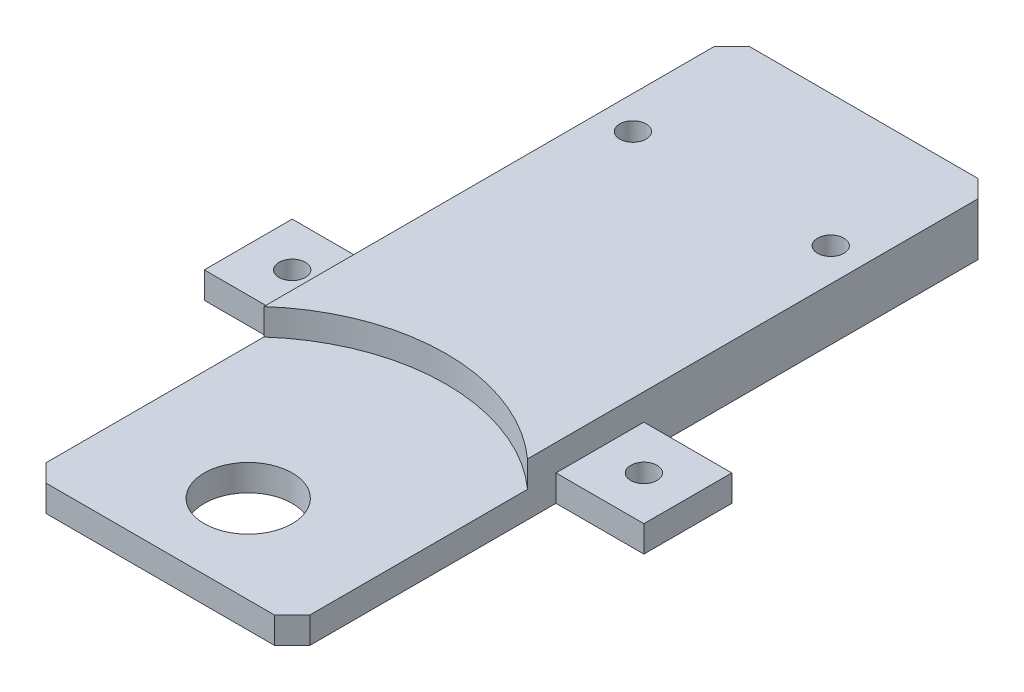
ISO-10303-21;
HEADER;
FILE_DESCRIPTION(('STEP AP214'),'2;1');
FILE_NAME('part.step','',(''),(''),'','','');
FILE_SCHEMA(('AUTOMOTIVE_DESIGN { 1 0 10303 214 1 1 1 1 }'));
ENDSEC;
DATA;
#1=APPLICATION_CONTEXT('core data for automotive mechanical design processes');
#2=APPLICATION_PROTOCOL_DEFINITION('international standard','automotive_design',2000,#1);
#3=PRODUCT_CONTEXT('',#1,'mechanical');
#4=PRODUCT('Part','Part','',(#3));
#5=PRODUCT_RELATED_PRODUCT_CATEGORY('part','',(#4));
#6=PRODUCT_DEFINITION_FORMATION('','',#4);
#7=PRODUCT_DEFINITION_CONTEXT('part definition',#1,'design');
#8=PRODUCT_DEFINITION('design','',#6,#7);
#9=PRODUCT_DEFINITION_SHAPE('','',#8);
#10=(LENGTH_UNIT() NAMED_UNIT(*) SI_UNIT(.MILLI.,.METRE.));
#11=(NAMED_UNIT(*) PLANE_ANGLE_UNIT() SI_UNIT($,.RADIAN.));
#12=(NAMED_UNIT(*) SI_UNIT($,.STERADIAN.) SOLID_ANGLE_UNIT());
#13=UNCERTAINTY_MEASURE_WITH_UNIT(LENGTH_MEASURE(1.E-05),#10,'distance_accuracy_value','');
#14=(GEOMETRIC_REPRESENTATION_CONTEXT(3) GLOBAL_UNCERTAINTY_ASSIGNED_CONTEXT((#13)) GLOBAL_UNIT_ASSIGNED_CONTEXT((#10,
#11,#12)) REPRESENTATION_CONTEXT('',''));
#15=CARTESIAN_POINT('',(0.,0.,0.));
#16=DIRECTION('',(0.,0.,1.));
#17=DIRECTION('',(1.,0.,0.));
#18=AXIS2_PLACEMENT_3D('',#15,#16,#17);
#19=CARTESIAN_POINT('',(0.,3.,-80.));
#20=DIRECTION('',(1.,0.,0.));
#21=DIRECTION('',(0.,0.,-1.));
#22=AXIS2_PLACEMENT_3D('',#19,#20,#21);
#23=PLANE('',#22);
#24=DIRECTION('',(0.,1.,0.));
#25=VECTOR('',#24,1.);
#26=CARTESIAN_POINT('',(0.,3.,-30.));
#27=LINE('',#26,#25);
#28=CARTESIAN_POINT('',(0.,0.,-30.));
#29=VERTEX_POINT('',#28);
#30=CARTESIAN_POINT('',(0.,3.,-30.));
#31=VERTEX_POINT('',#30);
#32=EDGE_CURVE('E232',#29,#31,#27,.T.);
#33=ORIENTED_EDGE('',*,*,#32,.F.);
#34=DIRECTION('',(0.,0.,1.));
#35=VECTOR('',#34,1.);
#36=CARTESIAN_POINT('',(0.,0.,-80.));
#37=LINE('',#36,#35);
#38=CARTESIAN_POINT('',(0.,0.,-1.99999999999999));
#39=VERTEX_POINT('',#38);
#40=EDGE_CURVE('E325',#29,#39,#37,.T.);
#41=ORIENTED_EDGE('',*,*,#40,.T.);
#42=DIRECTION('',(0.,1.,0.));
#43=VECTOR('',#42,1.);
#44=CARTESIAN_POINT('',(0.,3.,-1.99999999999999));
#45=LINE('',#44,#43);
#46=CARTESIAN_POINT('',(0.,3.,-1.99999999999999));
#47=VERTEX_POINT('',#46);
#48=EDGE_CURVE('E382',#39,#47,#45,.T.);
#49=ORIENTED_EDGE('',*,*,#48,.T.);
#50=DIRECTION('',(0.,0.,1.));
#51=VECTOR('',#50,1.);
#52=CARTESIAN_POINT('',(0.,3.,-80.));
#53=LINE('',#52,#51);
#54=CARTESIAN_POINT('',(0.,3.,-26.7705098312484));
#55=VERTEX_POINT('',#54);
#56=EDGE_CURVE('E323',#55,#47,#53,.T.);
#57=ORIENTED_EDGE('',*,*,#56,.F.);
#58=DIRECTION('',(0.,-1.,0.));
#59=VECTOR('',#58,1.);
#60=CARTESIAN_POINT('',(0.,6.,-26.7705098312484));
#61=LINE('',#60,#59);
#62=CARTESIAN_POINT('',(0.,6.,-26.7705098312484));
#63=VERTEX_POINT('',#62);
#64=EDGE_CURVE('E315',#63,#55,#61,.T.);
#65=ORIENTED_EDGE('',*,*,#64,.F.);
#66=DIRECTION('',(0.,0.,1.));
#67=VECTOR('',#66,1.);
#68=CARTESIAN_POINT('',(0.,6.,0.));
#69=LINE('',#68,#67);
#70=CARTESIAN_POINT('',(0.,6.,-78.));
#71=VERTEX_POINT('',#70);
#72=EDGE_CURVE('E310',#71,#63,#69,.T.);
#73=ORIENTED_EDGE('',*,*,#72,.F.);
#74=DIRECTION('',(0.,-1.,0.));
#75=VECTOR('',#74,1.);
#76=CARTESIAN_POINT('',(0.,3.,-78.));
#77=LINE('',#76,#75);
#78=CARTESIAN_POINT('',(0.,0.,-78.));
#79=VERTEX_POINT('',#78);
#80=EDGE_CURVE('E387',#71,#79,#77,.T.);
#81=ORIENTED_EDGE('',*,*,#80,.T.);
#82=CARTESIAN_POINT('',(0.,0.,-40.));
#83=VERTEX_POINT('',#82);
#84=EDGE_CURVE('E336',#79,#83,#37,.T.);
#85=ORIENTED_EDGE('',*,*,#84,.T.);
#86=DIRECTION('',(0.,-1.,0.));
#87=VECTOR('',#86,1.);
#88=CARTESIAN_POINT('',(0.,3.,-40.));
#89=LINE('',#88,#87);
#90=CARTESIAN_POINT('',(0.,3.,-40.));
#91=VERTEX_POINT('',#90);
#92=EDGE_CURVE('E238',#91,#83,#89,.T.);
#93=ORIENTED_EDGE('',*,*,#92,.F.);
#94=DIRECTION('',(0.,0.,-1.));
#95=VECTOR('',#94,1.);
#96=CARTESIAN_POINT('',(0.,3.,-30.));
#97=LINE('',#96,#95);
#98=EDGE_CURVE('E75',#31,#91,#97,.T.);
#99=ORIENTED_EDGE('',*,*,#98,.F.);
#100=EDGE_LOOP('',(#33,#41,#49,#57,#65,#73,#81,#85,#93,#99));
#101=FACE_BOUND('',#100,.T.);
#102=ADVANCED_FACE('F50',(#101),#23,.F.);
#103=CARTESIAN_POINT('',(0.,3.,0.));
#104=DIRECTION('',(0.,1.,0.));
#105=DIRECTION('',(0.,0.,1.));
#106=AXIS2_PLACEMENT_3D('',#103,#104,#105);
#107=PLANE('',#106);
#108=CARTESIAN_POINT('',(15.,3.,-10.));
#109=DIRECTION('',(0.,1.,0.));
#110=DIRECTION('',(0.,0.,1.));
#111=AXIS2_PLACEMENT_3D('',#108,#109,#110);
#112=CIRCLE('',#111,5.);
#113=CARTESIAN_POINT('',(15.,3.,-5.));
#114=VERTEX_POINT('',#113);
#115=EDGE_CURVE('E280',#114,#114,#112,.T.);
#116=ORIENTED_EDGE('',*,*,#115,.F.);
#117=EDGE_LOOP('',(#116));
#118=FACE_BOUND('',#117,.T.);
#119=ORIENTED_EDGE('',*,*,#56,.T.);
#120=DIRECTION('',(-0.707106781186549,0.,-0.707106781186546));
#121=VECTOR('',#120,1.);
#122=CARTESIAN_POINT('',(0.999999999999994,3.,-0.999999999999997));
#123=LINE('',#122,#121);
#124=CARTESIAN_POINT('',(1.99999999999999,3.,0.));
#125=VERTEX_POINT('',#124);
#126=EDGE_CURVE('E11',#47,#125,#123,.F.);
#127=ORIENTED_EDGE('',*,*,#126,.T.);
#128=DIRECTION('',(1.,0.,0.));
#129=VECTOR('',#128,1.);
#130=CARTESIAN_POINT('',(0.,3.,0.));
#131=LINE('',#130,#129);
#132=CARTESIAN_POINT('',(28.,3.,0.));
#133=VERTEX_POINT('',#132);
#134=EDGE_CURVE('E330',#125,#133,#131,.T.);
#135=ORIENTED_EDGE('',*,*,#134,.T.);
#136=DIRECTION('',(-0.707106781186548,0.,0.707106781186548));
#137=VECTOR('',#136,1.);
#138=CARTESIAN_POINT('',(14.,3.,14.));
#139=LINE('',#138,#137);
#140=CARTESIAN_POINT('',(30.,3.,-2.00000000000002));
#141=VERTEX_POINT('',#140);
#142=EDGE_CURVE('E60',#133,#141,#139,.F.);
#143=ORIENTED_EDGE('',*,*,#142,.T.);
#144=DIRECTION('',(0.,0.,-1.));
#145=VECTOR('',#144,1.);
#146=CARTESIAN_POINT('',(30.,3.,-80.));
#147=LINE('',#146,#145);
#148=CARTESIAN_POINT('',(30.,3.,-26.7705098312485));
#149=VERTEX_POINT('',#148);
#150=EDGE_CURVE('E335',#141,#149,#147,.T.);
#151=ORIENTED_EDGE('',*,*,#150,.T.);
#152=CARTESIAN_POINT('',(15.,3.,-10.));
#153=DIRECTION('',(0.,1.,0.));
#154=DIRECTION('',(0.,0.,1.));
#155=AXIS2_PLACEMENT_3D('',#152,#153,#154);
#156=CIRCLE('',#155,22.5);
#157=EDGE_CURVE('E291',#149,#55,#156,.T.);
#158=ORIENTED_EDGE('',*,*,#157,.T.);
#159=EDGE_LOOP('',(#119,#127,#135,#143,#151,#158));
#160=FACE_BOUND('',#159,.T.);
#161=ADVANCED_FACE('F399',(#118,#160),#107,.T.);
#162=CARTESIAN_POINT('',(0.,3.,0.));
#163=DIRECTION('',(0.,0.,-1.));
#164=DIRECTION('',(-1.,0.,0.));
#165=AXIS2_PLACEMENT_3D('',#162,#163,#164);
#166=PLANE('',#165);
#167=ORIENTED_EDGE('',*,*,#134,.F.);
#168=DIRECTION('',(0.,-1.,0.));
#169=VECTOR('',#168,1.);
#170=CARTESIAN_POINT('',(1.99999999999999,3.,0.));
#171=LINE('',#170,#169);
#172=CARTESIAN_POINT('',(1.99999999999999,0.,0.));
#173=VERTEX_POINT('',#172);
#174=EDGE_CURVE('E394',#125,#173,#171,.T.);
#175=ORIENTED_EDGE('',*,*,#174,.T.);
#176=DIRECTION('',(1.,0.,0.));
#177=VECTOR('',#176,1.);
#178=CARTESIAN_POINT('',(0.,0.,0.));
#179=LINE('',#178,#177);
#180=CARTESIAN_POINT('',(28.,0.,0.));
#181=VERTEX_POINT('',#180);
#182=EDGE_CURVE('E338',#173,#181,#179,.T.);
#183=ORIENTED_EDGE('',*,*,#182,.T.);
#184=DIRECTION('',(0.,1.,0.));
#185=VECTOR('',#184,1.);
#186=CARTESIAN_POINT('',(28.,3.,0.));
#187=LINE('',#186,#185);
#188=EDGE_CURVE('E388',#181,#133,#187,.T.);
#189=ORIENTED_EDGE('',*,*,#188,.T.);
#190=EDGE_LOOP('',(#167,#175,#183,#189));
#191=FACE_BOUND('',#190,.T.);
#192=ADVANCED_FACE('F413',(#191),#166,.F.);
#193=CARTESIAN_POINT('',(30.,3.,-80.));
#194=DIRECTION('',(-1.,0.,0.));
#195=DIRECTION('',(0.,0.,1.));
#196=AXIS2_PLACEMENT_3D('',#193,#194,#195);
#197=PLANE('',#196);
#198=DIRECTION('',(0.,0.,-1.));
#199=VECTOR('',#198,1.);
#200=CARTESIAN_POINT('',(30.,0.,-80.));
#201=LINE('',#200,#199);
#202=CARTESIAN_POINT('',(30.,0.,-2.00000000000002));
#203=VERTEX_POINT('',#202);
#204=CARTESIAN_POINT('',(30.,0.,-30.));
#205=VERTEX_POINT('',#204);
#206=EDGE_CURVE('E342',#203,#205,#201,.T.);
#207=ORIENTED_EDGE('',*,*,#206,.T.);
#208=DIRECTION('',(0.,1.,0.));
#209=VECTOR('',#208,1.);
#210=CARTESIAN_POINT('',(30.,3.,-30.));
#211=LINE('',#210,#209);
#212=CARTESIAN_POINT('',(30.,3.,-30.));
#213=VERTEX_POINT('',#212);
#214=EDGE_CURVE('E179',#205,#213,#211,.T.);
#215=ORIENTED_EDGE('',*,*,#214,.T.);
#216=DIRECTION('',(0.,0.,-1.));
#217=VECTOR('',#216,1.);
#218=CARTESIAN_POINT('',(30.,3.,-30.));
#219=LINE('',#218,#217);
#220=CARTESIAN_POINT('',(30.,3.,-40.));
#221=VERTEX_POINT('',#220);
#222=EDGE_CURVE('E198',#213,#221,#219,.T.);
#223=ORIENTED_EDGE('',*,*,#222,.T.);
#224=DIRECTION('',(0.,-1.,0.));
#225=VECTOR('',#224,1.);
#226=CARTESIAN_POINT('',(30.,3.,-40.));
#227=LINE('',#226,#225);
#228=CARTESIAN_POINT('',(30.,0.,-40.));
#229=VERTEX_POINT('',#228);
#230=EDGE_CURVE('E213',#221,#229,#227,.T.);
#231=ORIENTED_EDGE('',*,*,#230,.T.);
#232=CARTESIAN_POINT('',(30.,0.,-78.));
#233=VERTEX_POINT('',#232);
#234=EDGE_CURVE('E341',#229,#233,#201,.T.);
#235=ORIENTED_EDGE('',*,*,#234,.T.);
#236=DIRECTION('',(0.,1.,0.));
#237=VECTOR('',#236,1.);
#238=CARTESIAN_POINT('',(30.,3.,-78.));
#239=LINE('',#238,#237);
#240=CARTESIAN_POINT('',(30.,6.,-78.));
#241=VERTEX_POINT('',#240);
#242=EDGE_CURVE('E372',#233,#241,#239,.T.);
#243=ORIENTED_EDGE('',*,*,#242,.T.);
#244=DIRECTION('',(0.,0.,-1.));
#245=VECTOR('',#244,1.);
#246=CARTESIAN_POINT('',(30.,6.,0.));
#247=LINE('',#246,#245);
#248=CARTESIAN_POINT('',(30.,6.,-26.7705098312485));
#249=VERTEX_POINT('',#248);
#250=EDGE_CURVE('E303',#249,#241,#247,.T.);
#251=ORIENTED_EDGE('',*,*,#250,.F.);
#252=DIRECTION('',(0.,-1.,0.));
#253=VECTOR('',#252,1.);
#254=CARTESIAN_POINT('',(30.,6.,-26.7705098312485));
#255=LINE('',#254,#253);
#256=EDGE_CURVE('E318',#249,#149,#255,.T.);
#257=ORIENTED_EDGE('',*,*,#256,.T.);
#258=ORIENTED_EDGE('',*,*,#150,.F.);
#259=DIRECTION('',(0.,-1.,0.));
#260=VECTOR('',#259,1.);
#261=CARTESIAN_POINT('',(30.,3.,-2.00000000000002));
#262=LINE('',#261,#260);
#263=EDGE_CURVE('E367',#141,#203,#262,.T.);
#264=ORIENTED_EDGE('',*,*,#263,.T.);
#265=EDGE_LOOP('',(#207,#215,#223,#231,#235,#243,#251,#257,#258,#264));
#266=FACE_BOUND('',#265,.T.);
#267=ADVANCED_FACE('F406',(#266),#197,.F.);
#268=CARTESIAN_POINT('',(0.,3.,-80.));
#269=DIRECTION('',(0.,0.,1.));
#270=DIRECTION('',(1.,0.,0.));
#271=AXIS2_PLACEMENT_3D('',#268,#269,#270);
#272=PLANE('',#271);
#273=DIRECTION('',(-1.,0.,0.));
#274=VECTOR('',#273,1.);
#275=CARTESIAN_POINT('',(0.,6.,-80.));
#276=LINE('',#275,#274);
#277=CARTESIAN_POINT('',(28.,6.,-80.));
#278=VERTEX_POINT('',#277);
#279=CARTESIAN_POINT('',(1.99999999999997,6.,-80.));
#280=VERTEX_POINT('',#279);
#281=EDGE_CURVE('E304',#278,#280,#276,.T.);
#282=ORIENTED_EDGE('',*,*,#281,.F.);
#283=DIRECTION('',(0.,-1.,0.));
#284=VECTOR('',#283,1.);
#285=CARTESIAN_POINT('',(28.,3.,-80.));
#286=LINE('',#285,#284);
#287=CARTESIAN_POINT('',(28.,0.,-80.));
#288=VERTEX_POINT('',#287);
#289=EDGE_CURVE('E352',#278,#288,#286,.T.);
#290=ORIENTED_EDGE('',*,*,#289,.T.);
#291=DIRECTION('',(-1.,0.,0.));
#292=VECTOR('',#291,1.);
#293=CARTESIAN_POINT('',(0.,0.,-80.));
#294=LINE('',#293,#292);
#295=CARTESIAN_POINT('',(1.99999999999997,0.,-80.));
#296=VERTEX_POINT('',#295);
#297=EDGE_CURVE('E327',#288,#296,#294,.T.);
#298=ORIENTED_EDGE('',*,*,#297,.T.);
#299=DIRECTION('',(0.,1.,0.));
#300=VECTOR('',#299,1.);
#301=CARTESIAN_POINT('',(1.99999999999997,3.,-80.));
#302=LINE('',#301,#300);
#303=EDGE_CURVE('E333',#296,#280,#302,.T.);
#304=ORIENTED_EDGE('',*,*,#303,.T.);
#305=EDGE_LOOP('',(#282,#290,#298,#304));
#306=FACE_BOUND('',#305,.T.);
#307=ADVANCED_FACE('F505',(#306),#272,.F.);
#308=CARTESIAN_POINT('',(0.,0.,0.));
#309=DIRECTION('',(0.,1.,0.));
#310=DIRECTION('',(0.,0.,1.));
#311=AXIS2_PLACEMENT_3D('',#308,#309,#310);
#312=PLANE('',#311);
#313=CARTESIAN_POINT('',(35.,0.,-35.));
#314=DIRECTION('',(0.,1.,0.));
#315=DIRECTION('',(0.,0.,1.));
#316=AXIS2_PLACEMENT_3D('',#313,#314,#315);
#317=CIRCLE('',#316,1.5);
#318=CARTESIAN_POINT('',(35.,0.,-33.5));
#319=VERTEX_POINT('',#318);
#320=EDGE_CURVE('E665',#319,#319,#317,.T.);
#321=ORIENTED_EDGE('',*,*,#320,.T.);
#322=EDGE_LOOP('',(#321));
#323=FACE_BOUND('',#322,.T.);
#324=CARTESIAN_POINT('',(-5.00000000000001,0.,-35.));
#325=DIRECTION('',(0.,1.,0.));
#326=DIRECTION('',(0.,0.,1.));
#327=AXIS2_PLACEMENT_3D('',#324,#325,#326);
#328=CIRCLE('',#327,1.5);
#329=CARTESIAN_POINT('',(-5.00000000000001,0.,-33.5));
#330=VERTEX_POINT('',#329);
#331=EDGE_CURVE('E186',#330,#330,#328,.T.);
#332=ORIENTED_EDGE('',*,*,#331,.T.);
#333=EDGE_LOOP('',(#332));
#334=FACE_BOUND('',#333,.T.);
#335=CARTESIAN_POINT('',(26.25,0.,-65.));
#336=DIRECTION('',(0.,1.,0.));
#337=DIRECTION('',(0.,0.,1.));
#338=AXIS2_PLACEMENT_3D('',#335,#336,#337);
#339=CIRCLE('',#338,1.5);
#340=CARTESIAN_POINT('',(26.25,0.,-63.5));
#341=VERTEX_POINT('',#340);
#342=EDGE_CURVE('E272',#341,#341,#339,.T.);
#343=ORIENTED_EDGE('',*,*,#342,.T.);
#344=EDGE_LOOP('',(#343));
#345=FACE_BOUND('',#344,.T.);
#346=CARTESIAN_POINT('',(3.74999999999998,0.,-65.));
#347=DIRECTION('',(0.,1.,0.));
#348=DIRECTION('',(0.,0.,1.));
#349=AXIS2_PLACEMENT_3D('',#346,#347,#348);
#350=CIRCLE('',#349,1.5);
#351=CARTESIAN_POINT('',(3.74999999999998,0.,-63.5));
#352=VERTEX_POINT('',#351);
#353=EDGE_CURVE('E275',#352,#352,#350,.T.);
#354=ORIENTED_EDGE('',*,*,#353,.T.);
#355=EDGE_LOOP('',(#354));
#356=FACE_BOUND('',#355,.T.);
#357=CARTESIAN_POINT('',(15.,0.,-10.));
#358=DIRECTION('',(0.,1.,0.));
#359=DIRECTION('',(0.,0.,1.));
#360=AXIS2_PLACEMENT_3D('',#357,#358,#359);
#361=CIRCLE('',#360,5.);
#362=CARTESIAN_POINT('',(15.,0.,-5.));
#363=VERTEX_POINT('',#362);
#364=EDGE_CURVE('E287',#363,#363,#361,.T.);
#365=ORIENTED_EDGE('',*,*,#364,.T.);
#366=EDGE_LOOP('',(#365));
#367=FACE_BOUND('',#366,.T.);
#368=ORIENTED_EDGE('',*,*,#297,.F.);
#369=DIRECTION('',(-0.707106781186548,0.,-0.707106781186548));
#370=VECTOR('',#369,1.);
#371=CARTESIAN_POINT('',(28.,0.,-80.));
#372=LINE('',#371,#370);
#373=EDGE_CURVE('E368',#288,#233,#372,.F.);
#374=ORIENTED_EDGE('',*,*,#373,.T.);
#375=ORIENTED_EDGE('',*,*,#234,.F.);
#376=DIRECTION('',(-1.,0.,0.));
#377=VECTOR('',#376,1.);
#378=CARTESIAN_POINT('',(40.,0.,-40.));
#379=LINE('',#378,#377);
#380=CARTESIAN_POINT('',(40.,0.,-40.));
#381=VERTEX_POINT('',#380);
#382=EDGE_CURVE('E63',#381,#229,#379,.T.);
#383=ORIENTED_EDGE('',*,*,#382,.F.);
#384=DIRECTION('',(0.,0.,1.));
#385=VECTOR('',#384,1.);
#386=CARTESIAN_POINT('',(40.,0.,-30.));
#387=LINE('',#386,#385);
#388=CARTESIAN_POINT('',(40.,0.,-30.));
#389=VERTEX_POINT('',#388);
#390=EDGE_CURVE('E195',#381,#389,#387,.T.);
#391=ORIENTED_EDGE('',*,*,#390,.T.);
#392=DIRECTION('',(-1.,0.,0.));
#393=VECTOR('',#392,1.);
#394=CARTESIAN_POINT('',(40.,0.,-30.));
#395=LINE('',#394,#393);
#396=EDGE_CURVE('E173',#389,#205,#395,.T.);
#397=ORIENTED_EDGE('',*,*,#396,.T.);
#398=ORIENTED_EDGE('',*,*,#206,.F.);
#399=DIRECTION('',(0.707106781186548,0.,-0.707106781186548));
#400=VECTOR('',#399,1.);
#401=CARTESIAN_POINT('',(30.,0.,-2.00000000000002));
#402=LINE('',#401,#400);
#403=EDGE_CURVE('E358',#203,#181,#402,.F.);
#404=ORIENTED_EDGE('',*,*,#403,.T.);
#405=ORIENTED_EDGE('',*,*,#182,.F.);
#406=DIRECTION('',(0.707106781186549,0.,0.707106781186546));
#407=VECTOR('',#406,1.);
#408=CARTESIAN_POINT('',(1.99999999999999,0.,0.));
#409=LINE('',#408,#407);
#410=EDGE_CURVE('E357',#173,#39,#409,.F.);
#411=ORIENTED_EDGE('',*,*,#410,.T.);
#412=ORIENTED_EDGE('',*,*,#40,.F.);
#413=DIRECTION('',(1.,0.,0.));
#414=VECTOR('',#413,1.);
#415=CARTESIAN_POINT('',(-10.,0.,-30.));
#416=LINE('',#415,#414);
#417=CARTESIAN_POINT('',(-10.,0.,-30.));
#418=VERTEX_POINT('',#417);
#419=EDGE_CURVE('E247',#418,#29,#416,.T.);
#420=ORIENTED_EDGE('',*,*,#419,.F.);
#421=DIRECTION('',(0.,0.,1.));
#422=VECTOR('',#421,1.);
#423=CARTESIAN_POINT('',(-10.,0.,-30.));
#424=LINE('',#423,#422);
#425=CARTESIAN_POINT('',(-10.,0.,-40.));
#426=VERTEX_POINT('',#425);
#427=EDGE_CURVE('E248',#426,#418,#424,.T.);
#428=ORIENTED_EDGE('',*,*,#427,.F.);
#429=DIRECTION('',(1.,0.,0.));
#430=VECTOR('',#429,1.);
#431=CARTESIAN_POINT('',(-10.,0.,-40.));
#432=LINE('',#431,#430);
#433=EDGE_CURVE('E261',#426,#83,#432,.T.);
#434=ORIENTED_EDGE('',*,*,#433,.T.);
#435=ORIENTED_EDGE('',*,*,#84,.F.);
#436=DIRECTION('',(-0.70710678118655,0.,0.707106781186545));
#437=VECTOR('',#436,1.);
#438=CARTESIAN_POINT('',(0.,0.,-78.));
#439=LINE('',#438,#437);
#440=EDGE_CURVE('E361',#79,#296,#439,.F.);
#441=ORIENTED_EDGE('',*,*,#440,.T.);
#442=EDGE_LOOP('',(#368,#374,#375,#383,#391,#397,#398,#404,#405,#411,#412,#420,#428,#434,#435,#441));
#443=FACE_BOUND('',#442,.T.);
#444=ADVANCED_FACE('F200',(#323,#334,#345,#356,#367,#443),#312,.F.);
#445=CARTESIAN_POINT('',(15.,6.,-10.));
#446=DIRECTION('',(0.,-1.,0.));
#447=DIRECTION('',(0.,0.,-1.));
#448=AXIS2_PLACEMENT_3D('',#445,#446,#447);
#449=CYLINDRICAL_SURFACE('',#448,22.5);
#450=ORIENTED_EDGE('',*,*,#157,.F.);
#451=ORIENTED_EDGE('',*,*,#256,.F.);
#452=CARTESIAN_POINT('',(15.,6.,-10.));
#453=DIRECTION('',(0.,1.,0.));
#454=DIRECTION('',(0.,0.,1.));
#455=AXIS2_PLACEMENT_3D('',#452,#453,#454);
#456=CIRCLE('',#455,22.5);
#457=EDGE_CURVE('E297',#249,#63,#456,.T.);
#458=ORIENTED_EDGE('',*,*,#457,.T.);
#459=ORIENTED_EDGE('',*,*,#64,.T.);
#460=EDGE_LOOP('',(#450,#451,#458,#459));
#461=FACE_BOUND('',#460,.T.);
#462=ADVANCED_FACE('F499',(#461),#449,.F.);
#463=CARTESIAN_POINT('',(0.,6.,0.));
#464=DIRECTION('',(0.,1.,0.));
#465=DIRECTION('',(0.,0.,1.));
#466=AXIS2_PLACEMENT_3D('',#463,#464,#465);
#467=PLANE('',#466);
#468=CARTESIAN_POINT('',(26.25,6.,-65.));
#469=DIRECTION('',(0.,1.,0.));
#470=DIRECTION('',(0.,0.,1.));
#471=AXIS2_PLACEMENT_3D('',#468,#469,#470);
#472=CIRCLE('',#471,1.5);
#473=CARTESIAN_POINT('',(26.25,6.,-63.5));
#474=VERTEX_POINT('',#473);
#475=EDGE_CURVE('E279',#474,#474,#472,.T.);
#476=ORIENTED_EDGE('',*,*,#475,.F.);
#477=EDGE_LOOP('',(#476));
#478=FACE_BOUND('',#477,.T.);
#479=CARTESIAN_POINT('',(3.74999999999998,6.,-65.));
#480=DIRECTION('',(0.,1.,0.));
#481=DIRECTION('',(0.,0.,1.));
#482=AXIS2_PLACEMENT_3D('',#479,#480,#481);
#483=CIRCLE('',#482,1.5);
#484=CARTESIAN_POINT('',(3.74999999999998,6.,-63.5));
#485=VERTEX_POINT('',#484);
#486=EDGE_CURVE('E282',#485,#485,#483,.T.);
#487=ORIENTED_EDGE('',*,*,#486,.F.);
#488=EDGE_LOOP('',(#487));
#489=FACE_BOUND('',#488,.T.);
#490=ORIENTED_EDGE('',*,*,#250,.T.);
#491=DIRECTION('',(0.707106781186548,0.,0.707106781186548));
#492=VECTOR('',#491,1.);
#493=CARTESIAN_POINT('',(54.,6.,-54.));
#494=LINE('',#493,#492);
#495=EDGE_CURVE('E379',#241,#278,#494,.F.);
#496=ORIENTED_EDGE('',*,*,#495,.T.);
#497=ORIENTED_EDGE('',*,*,#281,.T.);
#498=DIRECTION('',(0.70710678118655,0.,-0.707106781186545));
#499=VECTOR('',#498,1.);
#500=CARTESIAN_POINT('',(-39.,6.,-39.0000000000003));
#501=LINE('',#500,#499);
#502=EDGE_CURVE('E380',#280,#71,#501,.F.);
#503=ORIENTED_EDGE('',*,*,#502,.T.);
#504=ORIENTED_EDGE('',*,*,#72,.T.);
#505=ORIENTED_EDGE('',*,*,#457,.F.);
#506=EDGE_LOOP('',(#490,#496,#497,#503,#504,#505));
#507=FACE_BOUND('',#506,.T.);
#508=ADVANCED_FACE('F494',(#478,#489,#507),#467,.T.);
#509=CARTESIAN_POINT('',(15.,0.,-10.));
#510=DIRECTION('',(0.,1.,0.));
#511=DIRECTION('',(0.,0.,1.));
#512=AXIS2_PLACEMENT_3D('',#509,#510,#511);
#513=CYLINDRICAL_SURFACE('',#512,5.);
#514=ORIENTED_EDGE('',*,*,#364,.F.);
#515=EDGE_LOOP('',(#514));
#516=FACE_BOUND('',#515,.T.);
#517=ORIENTED_EDGE('',*,*,#115,.T.);
#518=EDGE_LOOP('',(#517));
#519=FACE_BOUND('',#518,.T.);
#520=ADVANCED_FACE('F468',(#516,#519),#513,.F.);
#521=CARTESIAN_POINT('',(28.,3.,-80.));
#522=DIRECTION('',(-0.707106781186547,0.,0.707106781186547));
#523=DIRECTION('',(0.,-1.,0.));
#524=AXIS2_PLACEMENT_3D('',#521,#522,#523);
#525=PLANE('',#524);
#526=ORIENTED_EDGE('',*,*,#495,.F.);
#527=ORIENTED_EDGE('',*,*,#242,.F.);
#528=ORIENTED_EDGE('',*,*,#373,.F.);
#529=ORIENTED_EDGE('',*,*,#289,.F.);
#530=EDGE_LOOP('',(#526,#527,#528,#529));
#531=FACE_BOUND('',#530,.T.);
#532=ADVANCED_FACE('F459',(#531),#525,.F.);
#533=CARTESIAN_POINT('',(0.,3.,-78.));
#534=DIRECTION('',(0.707106781186545,0.,0.70710678118655));
#535=DIRECTION('',(0.,-1.,0.));
#536=AXIS2_PLACEMENT_3D('',#533,#534,#535);
#537=PLANE('',#536);
#538=ORIENTED_EDGE('',*,*,#502,.F.);
#539=ORIENTED_EDGE('',*,*,#303,.F.);
#540=ORIENTED_EDGE('',*,*,#440,.F.);
#541=ORIENTED_EDGE('',*,*,#80,.F.);
#542=EDGE_LOOP('',(#538,#539,#540,#541));
#543=FACE_BOUND('',#542,.T.);
#544=ADVANCED_FACE('F465',(#543),#537,.F.);
#545=CARTESIAN_POINT('',(1.99999999999999,3.,0.));
#546=DIRECTION('',(0.707106781186546,0.,-0.707106781186549));
#547=DIRECTION('',(0.,-1.,0.));
#548=AXIS2_PLACEMENT_3D('',#545,#546,#547);
#549=PLANE('',#548);
#550=ORIENTED_EDGE('',*,*,#126,.F.);
#551=ORIENTED_EDGE('',*,*,#48,.F.);
#552=ORIENTED_EDGE('',*,*,#410,.F.);
#553=ORIENTED_EDGE('',*,*,#174,.F.);
#554=EDGE_LOOP('',(#550,#551,#552,#553));
#555=FACE_BOUND('',#554,.T.);
#556=ADVANCED_FACE('F414',(#555),#549,.F.);
#557=CARTESIAN_POINT('',(30.,3.,-2.00000000000002));
#558=DIRECTION('',(-0.707106781186547,0.,-0.707106781186547));
#559=DIRECTION('',(0.,-1.,0.));
#560=AXIS2_PLACEMENT_3D('',#557,#558,#559);
#561=PLANE('',#560);
#562=ORIENTED_EDGE('',*,*,#142,.F.);
#563=ORIENTED_EDGE('',*,*,#188,.F.);
#564=ORIENTED_EDGE('',*,*,#403,.F.);
#565=ORIENTED_EDGE('',*,*,#263,.F.);
#566=EDGE_LOOP('',(#562,#563,#564,#565));
#567=FACE_BOUND('',#566,.T.);
#568=ADVANCED_FACE('F49',(#567),#561,.F.);
#569=CARTESIAN_POINT('',(3.74999999999998,0.,-65.));
#570=DIRECTION('',(0.,1.,0.));
#571=DIRECTION('',(0.,0.,1.));
#572=AXIS2_PLACEMENT_3D('',#569,#570,#571);
#573=CYLINDRICAL_SURFACE('',#572,1.5);
#574=ORIENTED_EDGE('',*,*,#353,.F.);
#575=EDGE_LOOP('',(#574));
#576=FACE_BOUND('',#575,.T.);
#577=ORIENTED_EDGE('',*,*,#486,.T.);
#578=EDGE_LOOP('',(#577));
#579=FACE_BOUND('',#578,.T.);
#580=ADVANCED_FACE('F479',(#576,#579),#573,.F.);
#581=CARTESIAN_POINT('',(26.25,0.,-65.));
#582=DIRECTION('',(0.,1.,0.));
#583=DIRECTION('',(0.,0.,1.));
#584=AXIS2_PLACEMENT_3D('',#581,#582,#583);
#585=CYLINDRICAL_SURFACE('',#584,1.5);
#586=ORIENTED_EDGE('',*,*,#342,.F.);
#587=EDGE_LOOP('',(#586));
#588=FACE_BOUND('',#587,.T.);
#589=ORIENTED_EDGE('',*,*,#475,.T.);
#590=EDGE_LOOP('',(#589));
#591=FACE_BOUND('',#590,.T.);
#592=ADVANCED_FACE('F443',(#588,#591),#585,.F.);
#593=CARTESIAN_POINT('',(-10.,3.,-30.));
#594=DIRECTION('',(0.,0.,-1.));
#595=DIRECTION('',(-1.,0.,0.));
#596=AXIS2_PLACEMENT_3D('',#593,#594,#595);
#597=PLANE('',#596);
#598=ORIENTED_EDGE('',*,*,#32,.T.);
#599=DIRECTION('',(1.,0.,0.));
#600=VECTOR('',#599,1.);
#601=CARTESIAN_POINT('',(-10.,3.,-30.));
#602=LINE('',#601,#600);
#603=CARTESIAN_POINT('',(-10.,3.,-30.));
#604=VERTEX_POINT('',#603);
#605=EDGE_CURVE('E267',#604,#31,#602,.T.);
#606=ORIENTED_EDGE('',*,*,#605,.F.);
#607=DIRECTION('',(0.,1.,0.));
#608=VECTOR('',#607,1.);
#609=CARTESIAN_POINT('',(-10.,3.,-30.));
#610=LINE('',#609,#608);
#611=EDGE_CURVE('E234',#418,#604,#610,.T.);
#612=ORIENTED_EDGE('',*,*,#611,.F.);
#613=ORIENTED_EDGE('',*,*,#419,.T.);
#614=EDGE_LOOP('',(#598,#606,#612,#613));
#615=FACE_BOUND('',#614,.T.);
#616=ADVANCED_FACE('F421',(#615),#597,.F.);
#617=CARTESIAN_POINT('',(-10.,3.,-30.));
#618=DIRECTION('',(0.,-1.,0.));
#619=DIRECTION('',(0.,0.,-1.));
#620=AXIS2_PLACEMENT_3D('',#617,#618,#619);
#621=PLANE('',#620);
#622=CARTESIAN_POINT('',(-5.00000000000001,3.,-35.));
#623=DIRECTION('',(0.,-1.,0.));
#624=DIRECTION('',(0.,0.,-1.));
#625=AXIS2_PLACEMENT_3D('',#622,#623,#624);
#626=CIRCLE('',#625,1.5);
#627=CARTESIAN_POINT('',(-5.00000000000001,3.,-36.5));
#628=VERTEX_POINT('',#627);
#629=EDGE_CURVE('E230',#628,#628,#626,.T.);
#630=ORIENTED_EDGE('',*,*,#629,.T.);
#631=EDGE_LOOP('',(#630));
#632=FACE_BOUND('',#631,.T.);
#633=ORIENTED_EDGE('',*,*,#98,.T.);
#634=DIRECTION('',(1.,0.,0.));
#635=VECTOR('',#634,1.);
#636=CARTESIAN_POINT('',(-10.,3.,-40.));
#637=LINE('',#636,#635);
#638=CARTESIAN_POINT('',(-10.,3.,-40.));
#639=VERTEX_POINT('',#638);
#640=EDGE_CURVE('E264',#639,#91,#637,.T.);
#641=ORIENTED_EDGE('',*,*,#640,.F.);
#642=DIRECTION('',(0.,0.,-1.));
#643=VECTOR('',#642,1.);
#644=CARTESIAN_POINT('',(-10.,3.,-30.));
#645=LINE('',#644,#643);
#646=EDGE_CURVE('E239',#604,#639,#645,.T.);
#647=ORIENTED_EDGE('',*,*,#646,.F.);
#648=ORIENTED_EDGE('',*,*,#605,.T.);
#649=EDGE_LOOP('',(#633,#641,#647,#648));
#650=FACE_BOUND('',#649,.T.);
#651=ADVANCED_FACE('F432',(#632,#650),#621,.F.);
#652=CARTESIAN_POINT('',(-10.,3.,-40.));
#653=DIRECTION('',(0.,0.,1.));
#654=DIRECTION('',(0.,-1.,0.));
#655=AXIS2_PLACEMENT_3D('',#652,#653,#654);
#656=PLANE('',#655);
#657=ORIENTED_EDGE('',*,*,#92,.T.);
#658=ORIENTED_EDGE('',*,*,#433,.F.);
#659=DIRECTION('',(0.,-1.,0.));
#660=VECTOR('',#659,1.);
#661=CARTESIAN_POINT('',(-10.,3.,-40.));
#662=LINE('',#661,#660);
#663=EDGE_CURVE('E244',#639,#426,#662,.T.);
#664=ORIENTED_EDGE('',*,*,#663,.F.);
#665=ORIENTED_EDGE('',*,*,#640,.T.);
#666=EDGE_LOOP('',(#657,#658,#664,#665));
#667=FACE_BOUND('',#666,.T.);
#668=ADVANCED_FACE('F435',(#667),#656,.F.);
#669=CARTESIAN_POINT('',(-10.,0.,0.));
#670=DIRECTION('',(1.,0.,0.));
#671=DIRECTION('',(0.,0.,-1.));
#672=AXIS2_PLACEMENT_3D('',#669,#670,#671);
#673=PLANE('',#672);
#674=ORIENTED_EDGE('',*,*,#611,.T.);
#675=ORIENTED_EDGE('',*,*,#646,.T.);
#676=ORIENTED_EDGE('',*,*,#663,.T.);
#677=ORIENTED_EDGE('',*,*,#427,.T.);
#678=EDGE_LOOP('',(#674,#675,#676,#677));
#679=FACE_BOUND('',#678,.T.);
#680=ADVANCED_FACE('F426',(#679),#673,.F.);
#681=CARTESIAN_POINT('',(-5.00000000000001,6.,-35.));
#682=DIRECTION('',(0.,1.,0.));
#683=DIRECTION('',(0.,0.,1.));
#684=AXIS2_PLACEMENT_3D('',#681,#682,#683);
#685=CYLINDRICAL_SURFACE('',#684,1.5);
#686=ORIENTED_EDGE('',*,*,#331,.F.);
#687=EDGE_LOOP('',(#686));
#688=FACE_BOUND('',#687,.T.);
#689=ORIENTED_EDGE('',*,*,#629,.F.);
#690=EDGE_LOOP('',(#689));
#691=FACE_BOUND('',#690,.T.);
#692=ADVANCED_FACE('F601',(#688,#691),#685,.F.);
#693=CARTESIAN_POINT('',(40.,3.,-30.));
#694=DIRECTION('',(0.,0.,1.));
#695=DIRECTION('',(1.,0.,0.));
#696=AXIS2_PLACEMENT_3D('',#693,#694,#695);
#697=PLANE('',#696);
#698=ORIENTED_EDGE('',*,*,#214,.F.);
#699=ORIENTED_EDGE('',*,*,#396,.F.);
#700=DIRECTION('',(0.,1.,0.));
#701=VECTOR('',#700,1.);
#702=CARTESIAN_POINT('',(40.,3.,-30.));
#703=LINE('',#702,#701);
#704=CARTESIAN_POINT('',(40.,3.,-30.));
#705=VERTEX_POINT('',#704);
#706=EDGE_CURVE('E180',#389,#705,#703,.T.);
#707=ORIENTED_EDGE('',*,*,#706,.T.);
#708=DIRECTION('',(-1.,0.,0.));
#709=VECTOR('',#708,1.);
#710=CARTESIAN_POINT('',(40.,3.,-30.));
#711=LINE('',#710,#709);
#712=EDGE_CURVE('E209',#705,#213,#711,.T.);
#713=ORIENTED_EDGE('',*,*,#712,.T.);
#714=EDGE_LOOP('',(#698,#699,#707,#713));
#715=FACE_BOUND('',#714,.T.);
#716=ADVANCED_FACE('F178',(#715),#697,.T.);
#717=CARTESIAN_POINT('',(40.,3.,-40.));
#718=DIRECTION('',(0.,0.,-1.));
#719=DIRECTION('',(0.,1.,0.));
#720=AXIS2_PLACEMENT_3D('',#717,#718,#719);
#721=PLANE('',#720);
#722=ORIENTED_EDGE('',*,*,#230,.F.);
#723=DIRECTION('',(-1.,0.,0.));
#724=VECTOR('',#723,1.);
#725=CARTESIAN_POINT('',(40.,3.,-40.));
#726=LINE('',#725,#724);
#727=CARTESIAN_POINT('',(40.,3.,-40.));
#728=VERTEX_POINT('',#727);
#729=EDGE_CURVE('E225',#728,#221,#726,.T.);
#730=ORIENTED_EDGE('',*,*,#729,.F.);
#731=DIRECTION('',(0.,-1.,0.));
#732=VECTOR('',#731,1.);
#733=CARTESIAN_POINT('',(40.,3.,-40.));
#734=LINE('',#733,#732);
#735=EDGE_CURVE('E205',#728,#381,#734,.T.);
#736=ORIENTED_EDGE('',*,*,#735,.T.);
#737=ORIENTED_EDGE('',*,*,#382,.T.);
#738=EDGE_LOOP('',(#722,#730,#736,#737));
#739=FACE_BOUND('',#738,.T.);
#740=ADVANCED_FACE('F618',(#739),#721,.T.);
#741=CARTESIAN_POINT('',(40.,3.,-30.));
#742=DIRECTION('',(0.,1.,0.));
#743=DIRECTION('',(0.,0.,1.));
#744=AXIS2_PLACEMENT_3D('',#741,#742,#743);
#745=PLANE('',#744);
#746=CARTESIAN_POINT('',(35.,3.,-35.));
#747=DIRECTION('',(0.,1.,0.));
#748=DIRECTION('',(0.,0.,1.));
#749=AXIS2_PLACEMENT_3D('',#746,#747,#748);
#750=CIRCLE('',#749,1.5);
#751=CARTESIAN_POINT('',(35.,3.,-33.5));
#752=VERTEX_POINT('',#751);
#753=EDGE_CURVE('E212',#752,#752,#750,.T.);
#754=ORIENTED_EDGE('',*,*,#753,.F.);
#755=EDGE_LOOP('',(#754));
#756=FACE_BOUND('',#755,.T.);
#757=ORIENTED_EDGE('',*,*,#222,.F.);
#758=ORIENTED_EDGE('',*,*,#712,.F.);
#759=DIRECTION('',(0.,0.,-1.));
#760=VECTOR('',#759,1.);
#761=CARTESIAN_POINT('',(40.,3.,-30.));
#762=LINE('',#761,#760);
#763=EDGE_CURVE('E192',#705,#728,#762,.T.);
#764=ORIENTED_EDGE('',*,*,#763,.T.);
#765=ORIENTED_EDGE('',*,*,#729,.T.);
#766=EDGE_LOOP('',(#757,#758,#764,#765));
#767=FACE_BOUND('',#766,.T.);
#768=ADVANCED_FACE('F624',(#756,#767),#745,.T.);
#769=CARTESIAN_POINT('',(40.,0.,0.));
#770=DIRECTION('',(-1.,0.,0.));
#771=DIRECTION('',(0.,0.,-1.));
#772=AXIS2_PLACEMENT_3D('',#769,#770,#771);
#773=PLANE('',#772);
#774=ORIENTED_EDGE('',*,*,#706,.F.);
#775=ORIENTED_EDGE('',*,*,#390,.F.);
#776=ORIENTED_EDGE('',*,*,#735,.F.);
#777=ORIENTED_EDGE('',*,*,#763,.F.);
#778=EDGE_LOOP('',(#774,#775,#776,#777));
#779=FACE_BOUND('',#778,.T.);
#780=ADVANCED_FACE('F190',(#779),#773,.F.);
#781=CARTESIAN_POINT('',(35.,6.,-35.));
#782=DIRECTION('',(0.,1.,0.));
#783=DIRECTION('',(0.,0.,1.));
#784=AXIS2_PLACEMENT_3D('',#781,#782,#783);
#785=CYLINDRICAL_SURFACE('',#784,1.5);
#786=ORIENTED_EDGE('',*,*,#753,.T.);
#787=EDGE_LOOP('',(#786));
#788=FACE_BOUND('',#787,.T.);
#789=ORIENTED_EDGE('',*,*,#320,.F.);
#790=EDGE_LOOP('',(#789));
#791=FACE_BOUND('',#790,.T.);
#792=ADVANCED_FACE('F639',(#788,#791),#785,.F.);
#793=CLOSED_SHELL('',(#102,#161,#192,#267,#307,#444,#462,#508,#520,#532,#544,#556,#568,#580,
#592,#616,#651,#668,#680,#692,#716,#740,#768,#780,#792));
#794=MANIFOLD_SOLID_BREP('B2',#793);
#795=ADVANCED_BREP_SHAPE_REPRESENTATION('',(#18,#794),#14);
#796=SHAPE_DEFINITION_REPRESENTATION(#9,#795);
ENDSEC;
END-ISO-10303-21;
